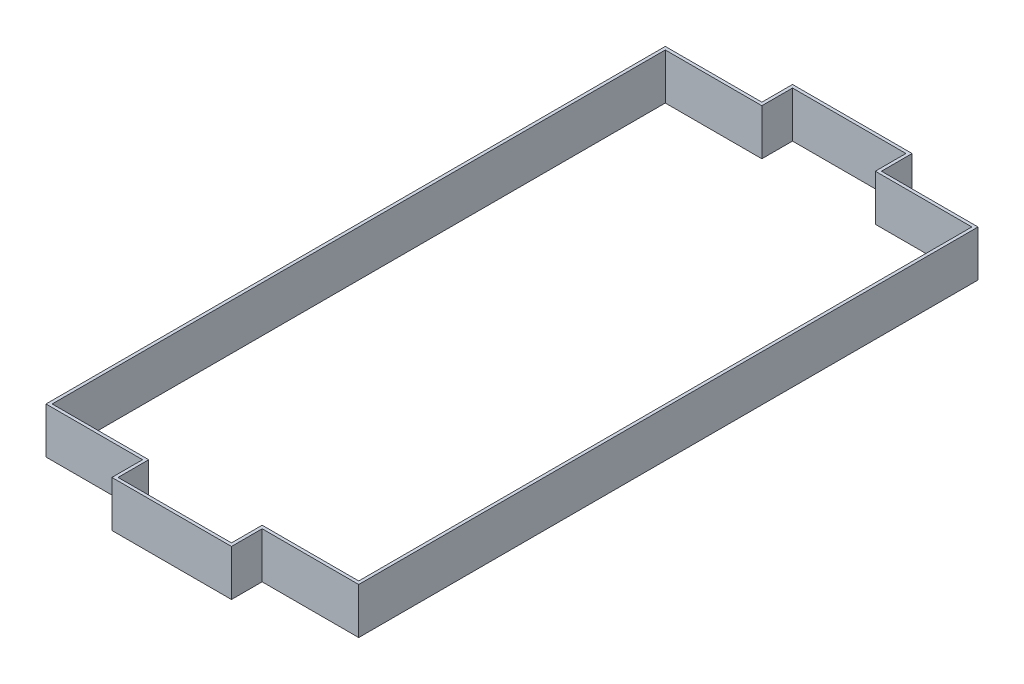
ISO-10303-21;
HEADER;
FILE_DESCRIPTION(('STEP AP214'),'2;1');
FILE_NAME('part.step','',(''),(''),'','','');
FILE_SCHEMA(('AUTOMOTIVE_DESIGN { 1 0 10303 214 1 1 1 1 }'));
ENDSEC;
DATA;
#1=APPLICATION_CONTEXT('core data for automotive mechanical design processes');
#2=APPLICATION_PROTOCOL_DEFINITION('international standard','automotive_design',2000,#1);
#3=PRODUCT_CONTEXT('',#1,'mechanical');
#4=PRODUCT('Part','Part','',(#3));
#5=PRODUCT_RELATED_PRODUCT_CATEGORY('part','',(#4));
#6=PRODUCT_DEFINITION_FORMATION('','',#4);
#7=PRODUCT_DEFINITION_CONTEXT('part definition',#1,'design');
#8=PRODUCT_DEFINITION('design','',#6,#7);
#9=PRODUCT_DEFINITION_SHAPE('','',#8);
#10=(LENGTH_UNIT() NAMED_UNIT(*) SI_UNIT(.MILLI.,.METRE.));
#11=(NAMED_UNIT(*) PLANE_ANGLE_UNIT() SI_UNIT($,.RADIAN.));
#12=(NAMED_UNIT(*) SI_UNIT($,.STERADIAN.) SOLID_ANGLE_UNIT());
#13=UNCERTAINTY_MEASURE_WITH_UNIT(LENGTH_MEASURE(1.E-05),#10,'distance_accuracy_value','');
#14=(GEOMETRIC_REPRESENTATION_CONTEXT(3) GLOBAL_UNCERTAINTY_ASSIGNED_CONTEXT((#13)) GLOBAL_UNIT_ASSIGNED_CONTEXT((#10,
#11,#12)) REPRESENTATION_CONTEXT('',''));
#15=CARTESIAN_POINT('',(0.,0.,0.));
#16=DIRECTION('',(0.,0.,1.));
#17=DIRECTION('',(1.,0.,0.));
#18=AXIS2_PLACEMENT_3D('',#15,#16,#17);
#19=CARTESIAN_POINT('',(0.,150.,-2100.));
#20=DIRECTION('',(0.,0.,-1.));
#21=DIRECTION('',(-1.,0.,0.));
#22=AXIS2_PLACEMENT_3D('',#19,#20,#21);
#23=PLANE('',#22);
#24=DIRECTION('',(1.,0.,0.));
#25=VECTOR('',#24,1.);
#26=CARTESIAN_POINT('',(0.,0.,-2100.));
#27=LINE('',#26,#25);
#28=CARTESIAN_POINT('',(315.,0.,-2100.));
#29=VERTEX_POINT('',#28);
#30=CARTESIAN_POINT('',(685.,0.,-2100.));
#31=VERTEX_POINT('',#30);
#32=EDGE_CURVE('E267',#29,#31,#27,.T.);
#33=ORIENTED_EDGE('',*,*,#32,.T.);
#34=DIRECTION('',(0.,-1.,0.));
#35=VECTOR('',#34,1.);
#36=CARTESIAN_POINT('',(685.,150.,-2100.));
#37=LINE('',#36,#35);
#38=CARTESIAN_POINT('',(685.,150.,-2100.));
#39=VERTEX_POINT('',#38);
#40=EDGE_CURVE('E11',#39,#31,#37,.T.);
#41=ORIENTED_EDGE('',*,*,#40,.F.);
#42=DIRECTION('',(1.,0.,0.));
#43=VECTOR('',#42,1.);
#44=CARTESIAN_POINT('',(0.,150.,-2100.));
#45=LINE('',#44,#43);
#46=CARTESIAN_POINT('',(315.,150.,-2100.));
#47=VERTEX_POINT('',#46);
#48=EDGE_CURVE('E386',#47,#39,#45,.T.);
#49=ORIENTED_EDGE('',*,*,#48,.F.);
#50=DIRECTION('',(0.,-1.,0.));
#51=VECTOR('',#50,1.);
#52=CARTESIAN_POINT('',(315.,150.,-2100.));
#53=LINE('',#52,#51);
#54=EDGE_CURVE('E54',#47,#29,#53,.T.);
#55=ORIENTED_EDGE('',*,*,#54,.T.);
#56=EDGE_LOOP('',(#33,#41,#49,#55));
#57=FACE_BOUND('',#56,.T.);
#58=ADVANCED_FACE('F35',(#57),#23,.F.);
#59=CARTESIAN_POINT('',(685.,150.,0.));
#60=DIRECTION('',(1.,0.,0.));
#61=DIRECTION('',(0.,0.,-1.));
#62=AXIS2_PLACEMENT_3D('',#59,#60,#61);
#63=PLANE('',#62);
#64=DIRECTION('',(0.,0.,1.));
#65=VECTOR('',#64,1.);
#66=CARTESIAN_POINT('',(685.,0.,0.));
#67=LINE('',#66,#65);
#68=CARTESIAN_POINT('',(685.,0.,-2000.));
#69=VERTEX_POINT('',#68);
#70=EDGE_CURVE('E269',#31,#69,#67,.T.);
#71=ORIENTED_EDGE('',*,*,#70,.T.);
#72=DIRECTION('',(0.,-1.,0.));
#73=VECTOR('',#72,1.);
#74=CARTESIAN_POINT('',(685.,150.,-2000.));
#75=LINE('',#74,#73);
#76=CARTESIAN_POINT('',(685.,150.,-2000.));
#77=VERTEX_POINT('',#76);
#78=EDGE_CURVE('E45',#77,#69,#75,.T.);
#79=ORIENTED_EDGE('',*,*,#78,.F.);
#80=DIRECTION('',(0.,0.,1.));
#81=VECTOR('',#80,1.);
#82=CARTESIAN_POINT('',(685.,150.,0.));
#83=LINE('',#82,#81);
#84=EDGE_CURVE('E388',#39,#77,#83,.T.);
#85=ORIENTED_EDGE('',*,*,#84,.F.);
#86=ORIENTED_EDGE('',*,*,#40,.T.);
#87=EDGE_LOOP('',(#71,#79,#85,#86));
#88=FACE_BOUND('',#87,.T.);
#89=ADVANCED_FACE('F423',(#88),#63,.F.);
#90=CARTESIAN_POINT('',(0.,150.,-2000.));
#91=DIRECTION('',(0.,0.,-1.));
#92=DIRECTION('',(-1.,0.,0.));
#93=AXIS2_PLACEMENT_3D('',#90,#91,#92);
#94=PLANE('',#93);
#95=DIRECTION('',(1.,0.,0.));
#96=VECTOR('',#95,1.);
#97=CARTESIAN_POINT('',(0.,0.,-2000.));
#98=LINE('',#97,#96);
#99=CARTESIAN_POINT('',(1000.,0.,-2000.));
#100=VERTEX_POINT('',#99);
#101=EDGE_CURVE('E271',#69,#100,#98,.T.);
#102=ORIENTED_EDGE('',*,*,#101,.T.);
#103=DIRECTION('',(0.,-1.,0.));
#104=VECTOR('',#103,1.);
#105=CARTESIAN_POINT('',(1000.,150.,-2000.));
#106=LINE('',#105,#104);
#107=CARTESIAN_POINT('',(1000.,150.,-2000.));
#108=VERTEX_POINT('',#107);
#109=EDGE_CURVE('E312',#108,#100,#106,.T.);
#110=ORIENTED_EDGE('',*,*,#109,.F.);
#111=DIRECTION('',(1.,0.,0.));
#112=VECTOR('',#111,1.);
#113=CARTESIAN_POINT('',(0.,150.,-2000.));
#114=LINE('',#113,#112);
#115=EDGE_CURVE('E390',#77,#108,#114,.T.);
#116=ORIENTED_EDGE('',*,*,#115,.F.);
#117=ORIENTED_EDGE('',*,*,#78,.T.);
#118=EDGE_LOOP('',(#102,#110,#116,#117));
#119=FACE_BOUND('',#118,.T.);
#120=ADVANCED_FACE('F428',(#119),#94,.F.);
#121=CARTESIAN_POINT('',(1000.,150.,0.));
#122=DIRECTION('',(-1.,0.,0.));
#123=DIRECTION('',(0.,0.,1.));
#124=AXIS2_PLACEMENT_3D('',#121,#122,#123);
#125=PLANE('',#124);
#126=DIRECTION('',(0.,0.,-1.));
#127=VECTOR('',#126,1.);
#128=CARTESIAN_POINT('',(1000.,0.,0.));
#129=LINE('',#128,#127);
#130=CARTESIAN_POINT('',(1000.,0.,0.));
#131=VERTEX_POINT('',#130);
#132=EDGE_CURVE('E274',#131,#100,#129,.T.);
#133=ORIENTED_EDGE('',*,*,#132,.F.);
#134=DIRECTION('',(0.,-1.,0.));
#135=VECTOR('',#134,1.);
#136=CARTESIAN_POINT('',(1000.,150.,0.));
#137=LINE('',#136,#135);
#138=CARTESIAN_POINT('',(1000.,150.,0.));
#139=VERTEX_POINT('',#138);
#140=EDGE_CURVE('E310',#139,#131,#137,.T.);
#141=ORIENTED_EDGE('',*,*,#140,.F.);
#142=DIRECTION('',(0.,0.,-1.));
#143=VECTOR('',#142,1.);
#144=CARTESIAN_POINT('',(1000.,150.,0.));
#145=LINE('',#144,#143);
#146=EDGE_CURVE('E392',#139,#108,#145,.T.);
#147=ORIENTED_EDGE('',*,*,#146,.T.);
#148=ORIENTED_EDGE('',*,*,#109,.T.);
#149=EDGE_LOOP('',(#133,#141,#147,#148));
#150=FACE_BOUND('',#149,.T.);
#151=ADVANCED_FACE('F492',(#150),#125,.T.);
#152=CARTESIAN_POINT('',(0.,150.,0.));
#153=DIRECTION('',(0.,0.,-1.));
#154=DIRECTION('',(-1.,0.,0.));
#155=AXIS2_PLACEMENT_3D('',#152,#153,#154);
#156=PLANE('',#155);
#157=DIRECTION('',(1.,0.,0.));
#158=VECTOR('',#157,1.);
#159=CARTESIAN_POINT('',(0.,0.,0.));
#160=LINE('',#159,#158);
#161=CARTESIAN_POINT('',(685.,0.,0.));
#162=VERTEX_POINT('',#161);
#163=EDGE_CURVE('E277',#162,#131,#160,.T.);
#164=ORIENTED_EDGE('',*,*,#163,.F.);
#165=DIRECTION('',(0.,-1.,0.));
#166=VECTOR('',#165,1.);
#167=CARTESIAN_POINT('',(685.,150.,0.));
#168=LINE('',#167,#166);
#169=CARTESIAN_POINT('',(685.,150.,0.));
#170=VERTEX_POINT('',#169);
#171=EDGE_CURVE('E308',#170,#162,#168,.T.);
#172=ORIENTED_EDGE('',*,*,#171,.F.);
#173=DIRECTION('',(1.,0.,0.));
#174=VECTOR('',#173,1.);
#175=CARTESIAN_POINT('',(0.,150.,0.));
#176=LINE('',#175,#174);
#177=EDGE_CURVE('E395',#170,#139,#176,.T.);
#178=ORIENTED_EDGE('',*,*,#177,.T.);
#179=ORIENTED_EDGE('',*,*,#140,.T.);
#180=EDGE_LOOP('',(#164,#172,#178,#179));
#181=FACE_BOUND('',#180,.T.);
#182=ADVANCED_FACE('F488',(#181),#156,.T.);
#183=CARTESIAN_POINT('',(685.,150.,0.));
#184=DIRECTION('',(1.,0.,0.));
#185=DIRECTION('',(0.,0.,-1.));
#186=AXIS2_PLACEMENT_3D('',#183,#184,#185);
#187=PLANE('',#186);
#188=DIRECTION('',(0.,0.,1.));
#189=VECTOR('',#188,1.);
#190=CARTESIAN_POINT('',(685.,0.,0.));
#191=LINE('',#190,#189);
#192=CARTESIAN_POINT('',(685.,0.,100.));
#193=VERTEX_POINT('',#192);
#194=EDGE_CURVE('E280',#162,#193,#191,.T.);
#195=ORIENTED_EDGE('',*,*,#194,.T.);
#196=DIRECTION('',(0.,-1.,0.));
#197=VECTOR('',#196,1.);
#198=CARTESIAN_POINT('',(685.,150.,100.));
#199=LINE('',#198,#197);
#200=CARTESIAN_POINT('',(685.,150.,100.));
#201=VERTEX_POINT('',#200);
#202=EDGE_CURVE('E305',#201,#193,#199,.T.);
#203=ORIENTED_EDGE('',*,*,#202,.F.);
#204=DIRECTION('',(0.,0.,1.));
#205=VECTOR('',#204,1.);
#206=CARTESIAN_POINT('',(685.,150.,0.));
#207=LINE('',#206,#205);
#208=EDGE_CURVE('E398',#170,#201,#207,.T.);
#209=ORIENTED_EDGE('',*,*,#208,.F.);
#210=ORIENTED_EDGE('',*,*,#171,.T.);
#211=EDGE_LOOP('',(#195,#203,#209,#210));
#212=FACE_BOUND('',#211,.T.);
#213=ADVANCED_FACE('F484',(#212),#187,.F.);
#214=CARTESIAN_POINT('',(0.,150.,100.));
#215=DIRECTION('',(0.,0.,1.));
#216=DIRECTION('',(1.,0.,0.));
#217=AXIS2_PLACEMENT_3D('',#214,#215,#216);
#218=PLANE('',#217);
#219=DIRECTION('',(-1.,0.,0.));
#220=VECTOR('',#219,1.);
#221=CARTESIAN_POINT('',(0.,0.,100.));
#222=LINE('',#221,#220);
#223=CARTESIAN_POINT('',(315.,0.,100.));
#224=VERTEX_POINT('',#223);
#225=EDGE_CURVE('E282',#193,#224,#222,.T.);
#226=ORIENTED_EDGE('',*,*,#225,.T.);
#227=DIRECTION('',(0.,-1.,0.));
#228=VECTOR('',#227,1.);
#229=CARTESIAN_POINT('',(315.,150.,100.));
#230=LINE('',#229,#228);
#231=CARTESIAN_POINT('',(315.,150.,100.));
#232=VERTEX_POINT('',#231);
#233=EDGE_CURVE('E303',#232,#224,#230,.T.);
#234=ORIENTED_EDGE('',*,*,#233,.F.);
#235=DIRECTION('',(-1.,0.,0.));
#236=VECTOR('',#235,1.);
#237=CARTESIAN_POINT('',(0.,150.,100.));
#238=LINE('',#237,#236);
#239=EDGE_CURVE('E400',#201,#232,#238,.T.);
#240=ORIENTED_EDGE('',*,*,#239,.F.);
#241=ORIENTED_EDGE('',*,*,#202,.T.);
#242=EDGE_LOOP('',(#226,#234,#240,#241));
#243=FACE_BOUND('',#242,.T.);
#244=ADVANCED_FACE('F480',(#243),#218,.F.);
#245=CARTESIAN_POINT('',(315.,150.,0.));
#246=DIRECTION('',(1.,0.,0.));
#247=DIRECTION('',(0.,0.,-1.));
#248=AXIS2_PLACEMENT_3D('',#245,#246,#247);
#249=PLANE('',#248);
#250=DIRECTION('',(0.,0.,1.));
#251=VECTOR('',#250,1.);
#252=CARTESIAN_POINT('',(315.,0.,0.));
#253=LINE('',#252,#251);
#254=CARTESIAN_POINT('',(315.,0.,0.));
#255=VERTEX_POINT('',#254);
#256=EDGE_CURVE('E285',#255,#224,#253,.T.);
#257=ORIENTED_EDGE('',*,*,#256,.F.);
#258=DIRECTION('',(0.,-1.,0.));
#259=VECTOR('',#258,1.);
#260=CARTESIAN_POINT('',(315.,150.,0.));
#261=LINE('',#260,#259);
#262=CARTESIAN_POINT('',(315.,150.,0.));
#263=VERTEX_POINT('',#262);
#264=EDGE_CURVE('E301',#263,#255,#261,.T.);
#265=ORIENTED_EDGE('',*,*,#264,.F.);
#266=DIRECTION('',(0.,0.,1.));
#267=VECTOR('',#266,1.);
#268=CARTESIAN_POINT('',(315.,150.,0.));
#269=LINE('',#268,#267);
#270=EDGE_CURVE('E402',#263,#232,#269,.T.);
#271=ORIENTED_EDGE('',*,*,#270,.T.);
#272=ORIENTED_EDGE('',*,*,#233,.T.);
#273=EDGE_LOOP('',(#257,#265,#271,#272));
#274=FACE_BOUND('',#273,.T.);
#275=ADVANCED_FACE('F477',(#274),#249,.T.);
#276=CARTESIAN_POINT('',(0.,150.,0.));
#277=DIRECTION('',(0.,0.,-1.));
#278=DIRECTION('',(-1.,0.,0.));
#279=AXIS2_PLACEMENT_3D('',#276,#277,#278);
#280=PLANE('',#279);
#281=DIRECTION('',(1.,0.,0.));
#282=VECTOR('',#281,1.);
#283=CARTESIAN_POINT('',(0.,0.,0.));
#284=LINE('',#283,#282);
#285=CARTESIAN_POINT('',(0.,0.,0.));
#286=VERTEX_POINT('',#285);
#287=EDGE_CURVE('E288',#286,#255,#284,.T.);
#288=ORIENTED_EDGE('',*,*,#287,.F.);
#289=DIRECTION('',(0.,-1.,0.));
#290=VECTOR('',#289,1.);
#291=CARTESIAN_POINT('',(0.,150.,0.));
#292=LINE('',#291,#290);
#293=CARTESIAN_POINT('',(0.,150.,0.));
#294=VERTEX_POINT('',#293);
#295=EDGE_CURVE('E224',#294,#286,#292,.T.);
#296=ORIENTED_EDGE('',*,*,#295,.F.);
#297=DIRECTION('',(1.,0.,0.));
#298=VECTOR('',#297,1.);
#299=CARTESIAN_POINT('',(0.,150.,0.));
#300=LINE('',#299,#298);
#301=EDGE_CURVE('E214',#294,#263,#300,.T.);
#302=ORIENTED_EDGE('',*,*,#301,.T.);
#303=ORIENTED_EDGE('',*,*,#264,.T.);
#304=EDGE_LOOP('',(#288,#296,#302,#303));
#305=FACE_BOUND('',#304,.T.);
#306=ADVANCED_FACE('F406',(#305),#280,.T.);
#307=CARTESIAN_POINT('',(0.,150.,0.));
#308=DIRECTION('',(-1.,0.,0.));
#309=DIRECTION('',(0.,0.,1.));
#310=AXIS2_PLACEMENT_3D('',#307,#308,#309);
#311=PLANE('',#310);
#312=DIRECTION('',(0.,0.,-1.));
#313=VECTOR('',#312,1.);
#314=CARTESIAN_POINT('',(0.,0.,0.));
#315=LINE('',#314,#313);
#316=CARTESIAN_POINT('',(0.,0.,-2000.));
#317=VERTEX_POINT('',#316);
#318=EDGE_CURVE('E221',#286,#317,#315,.T.);
#319=ORIENTED_EDGE('',*,*,#318,.T.);
#320=DIRECTION('',(0.,-1.,0.));
#321=VECTOR('',#320,1.);
#322=CARTESIAN_POINT('',(0.,150.,-2000.));
#323=LINE('',#322,#321);
#324=CARTESIAN_POINT('',(0.,150.,-2000.));
#325=VERTEX_POINT('',#324);
#326=EDGE_CURVE('E218',#325,#317,#323,.T.);
#327=ORIENTED_EDGE('',*,*,#326,.F.);
#328=DIRECTION('',(0.,0.,-1.));
#329=VECTOR('',#328,1.);
#330=CARTESIAN_POINT('',(0.,150.,0.));
#331=LINE('',#330,#329);
#332=EDGE_CURVE('E205',#294,#325,#331,.T.);
#333=ORIENTED_EDGE('',*,*,#332,.F.);
#334=ORIENTED_EDGE('',*,*,#295,.T.);
#335=EDGE_LOOP('',(#319,#327,#333,#334));
#336=FACE_BOUND('',#335,.T.);
#337=ADVANCED_FACE('F219',(#336),#311,.F.);
#338=CARTESIAN_POINT('',(0.,150.,-2000.));
#339=DIRECTION('',(0.,0.,-1.));
#340=DIRECTION('',(-1.,0.,0.));
#341=AXIS2_PLACEMENT_3D('',#338,#339,#340);
#342=PLANE('',#341);
#343=DIRECTION('',(1.,0.,0.));
#344=VECTOR('',#343,1.);
#345=CARTESIAN_POINT('',(0.,0.,-2000.));
#346=LINE('',#345,#344);
#347=CARTESIAN_POINT('',(315.,0.,-2000.));
#348=VERTEX_POINT('',#347);
#349=EDGE_CURVE('E292',#317,#348,#346,.T.);
#350=ORIENTED_EDGE('',*,*,#349,.T.);
#351=DIRECTION('',(0.,-1.,0.));
#352=VECTOR('',#351,1.);
#353=CARTESIAN_POINT('',(315.,150.,-2000.));
#354=LINE('',#353,#352);
#355=CARTESIAN_POINT('',(315.,150.,-2000.));
#356=VERTEX_POINT('',#355);
#357=EDGE_CURVE('E129',#356,#348,#354,.T.);
#358=ORIENTED_EDGE('',*,*,#357,.F.);
#359=DIRECTION('',(1.,0.,0.));
#360=VECTOR('',#359,1.);
#361=CARTESIAN_POINT('',(0.,150.,-2000.));
#362=LINE('',#361,#360);
#363=EDGE_CURVE('E211',#325,#356,#362,.T.);
#364=ORIENTED_EDGE('',*,*,#363,.F.);
#365=ORIENTED_EDGE('',*,*,#326,.T.);
#366=EDGE_LOOP('',(#350,#358,#364,#365));
#367=FACE_BOUND('',#366,.T.);
#368=ADVANCED_FACE('F226',(#367),#342,.F.);
#369=CARTESIAN_POINT('',(0.,150.,-2010.));
#370=DIRECTION('',(0.,0.,-1.));
#371=DIRECTION('',(-1.,0.,0.));
#372=AXIS2_PLACEMENT_3D('',#369,#370,#371);
#373=PLANE('',#372);
#374=DIRECTION('',(1.,0.,0.));
#375=VECTOR('',#374,1.);
#376=CARTESIAN_POINT('',(0.,0.,-2010.));
#377=LINE('',#376,#375);
#378=CARTESIAN_POINT('',(695.,0.,-2010.));
#379=VERTEX_POINT('',#378);
#380=CARTESIAN_POINT('',(1010.,0.,-2010.));
#381=VERTEX_POINT('',#380);
#382=EDGE_CURVE('E233',#379,#381,#377,.T.);
#383=ORIENTED_EDGE('',*,*,#382,.F.);
#384=DIRECTION('',(0.,-1.,0.));
#385=VECTOR('',#384,1.);
#386=CARTESIAN_POINT('',(695.,150.,-2010.));
#387=LINE('',#386,#385);
#388=CARTESIAN_POINT('',(695.,150.,-2010.));
#389=VERTEX_POINT('',#388);
#390=EDGE_CURVE('E39',#389,#379,#387,.T.);
#391=ORIENTED_EDGE('',*,*,#390,.F.);
#392=DIRECTION('',(1.,0.,0.));
#393=VECTOR('',#392,1.);
#394=CARTESIAN_POINT('',(0.,150.,-2010.));
#395=LINE('',#394,#393);
#396=CARTESIAN_POINT('',(1010.,150.,-2010.));
#397=VERTEX_POINT('',#396);
#398=EDGE_CURVE('E297',#389,#397,#395,.T.);
#399=ORIENTED_EDGE('',*,*,#398,.T.);
#400=DIRECTION('',(0.,-1.,0.));
#401=VECTOR('',#400,1.);
#402=CARTESIAN_POINT('',(1010.,150.,-2010.));
#403=LINE('',#402,#401);
#404=EDGE_CURVE('E229',#397,#381,#403,.T.);
#405=ORIENTED_EDGE('',*,*,#404,.T.);
#406=EDGE_LOOP('',(#383,#391,#399,#405));
#407=FACE_BOUND('',#406,.T.);
#408=ADVANCED_FACE('F37',(#407),#373,.T.);
#409=CARTESIAN_POINT('',(695.,150.,0.));
#410=DIRECTION('',(1.,0.,0.));
#411=DIRECTION('',(0.,0.,-1.));
#412=AXIS2_PLACEMENT_3D('',#409,#410,#411);
#413=PLANE('',#412);
#414=DIRECTION('',(0.,0.,1.));
#415=VECTOR('',#414,1.);
#416=CARTESIAN_POINT('',(695.,0.,0.));
#417=LINE('',#416,#415);
#418=CARTESIAN_POINT('',(695.,0.,-2110.));
#419=VERTEX_POINT('',#418);
#420=EDGE_CURVE('E236',#419,#379,#417,.T.);
#421=ORIENTED_EDGE('',*,*,#420,.F.);
#422=DIRECTION('',(0.,-1.,0.));
#423=VECTOR('',#422,1.);
#424=CARTESIAN_POINT('',(695.,150.,-2110.));
#425=LINE('',#424,#423);
#426=CARTESIAN_POINT('',(695.,150.,-2110.));
#427=VERTEX_POINT('',#426);
#428=EDGE_CURVE('E336',#427,#419,#425,.T.);
#429=ORIENTED_EDGE('',*,*,#428,.F.);
#430=DIRECTION('',(0.,0.,1.));
#431=VECTOR('',#430,1.);
#432=CARTESIAN_POINT('',(695.,150.,0.));
#433=LINE('',#432,#431);
#434=EDGE_CURVE('E345',#427,#389,#433,.T.);
#435=ORIENTED_EDGE('',*,*,#434,.T.);
#436=ORIENTED_EDGE('',*,*,#390,.T.);
#437=EDGE_LOOP('',(#421,#429,#435,#436));
#438=FACE_BOUND('',#437,.T.);
#439=ADVANCED_FACE('F343',(#438),#413,.T.);
#440=CARTESIAN_POINT('',(0.,150.,-2110.));
#441=DIRECTION('',(0.,0.,-1.));
#442=DIRECTION('',(-1.,0.,0.));
#443=AXIS2_PLACEMENT_3D('',#440,#441,#442);
#444=PLANE('',#443);
#445=DIRECTION('',(1.,0.,0.));
#446=VECTOR('',#445,1.);
#447=CARTESIAN_POINT('',(0.,0.,-2110.));
#448=LINE('',#447,#446);
#449=CARTESIAN_POINT('',(305.,0.,-2110.));
#450=VERTEX_POINT('',#449);
#451=EDGE_CURVE('E239',#450,#419,#448,.T.);
#452=ORIENTED_EDGE('',*,*,#451,.F.);
#453=DIRECTION('',(0.,-1.,0.));
#454=VECTOR('',#453,1.);
#455=CARTESIAN_POINT('',(305.,150.,-2110.));
#456=LINE('',#455,#454);
#457=CARTESIAN_POINT('',(305.,150.,-2110.));
#458=VERTEX_POINT('',#457);
#459=EDGE_CURVE('E335',#458,#450,#456,.T.);
#460=ORIENTED_EDGE('',*,*,#459,.F.);
#461=DIRECTION('',(1.,0.,0.));
#462=VECTOR('',#461,1.);
#463=CARTESIAN_POINT('',(0.,150.,-2110.));
#464=LINE('',#463,#462);
#465=EDGE_CURVE('E354',#458,#427,#464,.T.);
#466=ORIENTED_EDGE('',*,*,#465,.T.);
#467=ORIENTED_EDGE('',*,*,#428,.T.);
#468=EDGE_LOOP('',(#452,#460,#466,#467));
#469=FACE_BOUND('',#468,.T.);
#470=ADVANCED_FACE('F352',(#469),#444,.T.);
#471=CARTESIAN_POINT('',(305.,150.,0.));
#472=DIRECTION('',(-1.,0.,0.));
#473=DIRECTION('',(0.,0.,1.));
#474=AXIS2_PLACEMENT_3D('',#471,#472,#473);
#475=PLANE('',#474);
#476=DIRECTION('',(0.,0.,-1.));
#477=VECTOR('',#476,1.);
#478=CARTESIAN_POINT('',(305.,0.,0.));
#479=LINE('',#478,#477);
#480=CARTESIAN_POINT('',(305.,0.,-2010.));
#481=VERTEX_POINT('',#480);
#482=EDGE_CURVE('E242',#481,#450,#479,.T.);
#483=ORIENTED_EDGE('',*,*,#482,.F.);
#484=DIRECTION('',(0.,-1.,0.));
#485=VECTOR('',#484,1.);
#486=CARTESIAN_POINT('',(305.,150.,-2010.));
#487=LINE('',#486,#485);
#488=CARTESIAN_POINT('',(305.,150.,-2010.));
#489=VERTEX_POINT('',#488);
#490=EDGE_CURVE('E333',#489,#481,#487,.T.);
#491=ORIENTED_EDGE('',*,*,#490,.F.);
#492=DIRECTION('',(0.,0.,-1.));
#493=VECTOR('',#492,1.);
#494=CARTESIAN_POINT('',(305.,150.,0.));
#495=LINE('',#494,#493);
#496=EDGE_CURVE('E360',#489,#458,#495,.T.);
#497=ORIENTED_EDGE('',*,*,#496,.T.);
#498=ORIENTED_EDGE('',*,*,#459,.T.);
#499=EDGE_LOOP('',(#483,#491,#497,#498));
#500=FACE_BOUND('',#499,.T.);
#501=ADVANCED_FACE('F363',(#500),#475,.T.);
#502=CARTESIAN_POINT('',(0.,150.,-2010.));
#503=DIRECTION('',(0.,0.,-1.));
#504=DIRECTION('',(-1.,0.,0.));
#505=AXIS2_PLACEMENT_3D('',#502,#503,#504);
#506=PLANE('',#505);
#507=DIRECTION('',(1.,0.,0.));
#508=VECTOR('',#507,1.);
#509=CARTESIAN_POINT('',(0.,0.,-2010.));
#510=LINE('',#509,#508);
#511=CARTESIAN_POINT('',(-10.,0.,-2010.));
#512=VERTEX_POINT('',#511);
#513=EDGE_CURVE('E245',#512,#481,#510,.T.);
#514=ORIENTED_EDGE('',*,*,#513,.F.);
#515=DIRECTION('',(0.,-1.,0.));
#516=VECTOR('',#515,1.);
#517=CARTESIAN_POINT('',(-10.,150.,-2010.));
#518=LINE('',#517,#516);
#519=CARTESIAN_POINT('',(-10.,150.,-2010.));
#520=VERTEX_POINT('',#519);
#521=EDGE_CURVE('E331',#520,#512,#518,.T.);
#522=ORIENTED_EDGE('',*,*,#521,.F.);
#523=DIRECTION('',(1.,0.,0.));
#524=VECTOR('',#523,1.);
#525=CARTESIAN_POINT('',(0.,150.,-2010.));
#526=LINE('',#525,#524);
#527=EDGE_CURVE('E364',#520,#489,#526,.T.);
#528=ORIENTED_EDGE('',*,*,#527,.T.);
#529=ORIENTED_EDGE('',*,*,#490,.T.);
#530=EDGE_LOOP('',(#514,#522,#528,#529));
#531=FACE_BOUND('',#530,.T.);
#532=ADVANCED_FACE('F455',(#531),#506,.T.);
#533=CARTESIAN_POINT('',(-10.,150.,0.));
#534=DIRECTION('',(-1.,0.,0.));
#535=DIRECTION('',(0.,0.,1.));
#536=AXIS2_PLACEMENT_3D('',#533,#534,#535);
#537=PLANE('',#536);
#538=DIRECTION('',(0.,0.,-1.));
#539=VECTOR('',#538,1.);
#540=CARTESIAN_POINT('',(-10.,0.,0.));
#541=LINE('',#540,#539);
#542=CARTESIAN_POINT('',(-10.,0.,10.));
#543=VERTEX_POINT('',#542);
#544=EDGE_CURVE('E248',#543,#512,#541,.T.);
#545=ORIENTED_EDGE('',*,*,#544,.F.);
#546=DIRECTION('',(0.,-1.,0.));
#547=VECTOR('',#546,1.);
#548=CARTESIAN_POINT('',(-10.,150.,10.));
#549=LINE('',#548,#547);
#550=CARTESIAN_POINT('',(-10.,150.,10.));
#551=VERTEX_POINT('',#550);
#552=EDGE_CURVE('E329',#551,#543,#549,.T.);
#553=ORIENTED_EDGE('',*,*,#552,.F.);
#554=DIRECTION('',(0.,0.,-1.));
#555=VECTOR('',#554,1.);
#556=CARTESIAN_POINT('',(-10.,150.,0.));
#557=LINE('',#556,#555);
#558=EDGE_CURVE('E366',#551,#520,#557,.T.);
#559=ORIENTED_EDGE('',*,*,#558,.T.);
#560=ORIENTED_EDGE('',*,*,#521,.T.);
#561=EDGE_LOOP('',(#545,#553,#559,#560));
#562=FACE_BOUND('',#561,.T.);
#563=ADVANCED_FACE('F451',(#562),#537,.T.);
#564=CARTESIAN_POINT('',(0.,150.,10.));
#565=DIRECTION('',(0.,0.,-1.));
#566=DIRECTION('',(-1.,0.,0.));
#567=AXIS2_PLACEMENT_3D('',#564,#565,#566);
#568=PLANE('',#567);
#569=DIRECTION('',(1.,0.,0.));
#570=VECTOR('',#569,1.);
#571=CARTESIAN_POINT('',(0.,0.,10.));
#572=LINE('',#571,#570);
#573=CARTESIAN_POINT('',(305.,0.,10.));
#574=VERTEX_POINT('',#573);
#575=EDGE_CURVE('E251',#543,#574,#572,.T.);
#576=ORIENTED_EDGE('',*,*,#575,.T.);
#577=DIRECTION('',(0.,-1.,0.));
#578=VECTOR('',#577,1.);
#579=CARTESIAN_POINT('',(305.,150.,10.));
#580=LINE('',#579,#578);
#581=CARTESIAN_POINT('',(305.,150.,10.));
#582=VERTEX_POINT('',#581);
#583=EDGE_CURVE('E326',#582,#574,#580,.T.);
#584=ORIENTED_EDGE('',*,*,#583,.F.);
#585=DIRECTION('',(1.,0.,0.));
#586=VECTOR('',#585,1.);
#587=CARTESIAN_POINT('',(0.,150.,10.));
#588=LINE('',#587,#586);
#589=EDGE_CURVE('E372',#551,#582,#588,.T.);
#590=ORIENTED_EDGE('',*,*,#589,.F.);
#591=ORIENTED_EDGE('',*,*,#552,.T.);
#592=EDGE_LOOP('',(#576,#584,#590,#591));
#593=FACE_BOUND('',#592,.T.);
#594=ADVANCED_FACE('F447',(#593),#568,.F.);
#595=CARTESIAN_POINT('',(305.,150.,1.69309011255336E-13));
#596=DIRECTION('',(1.,0.,0.));
#597=DIRECTION('',(0.,0.,-1.));
#598=AXIS2_PLACEMENT_3D('',#595,#596,#597);
#599=PLANE('',#598);
#600=DIRECTION('',(0.,0.,1.));
#601=VECTOR('',#600,1.);
#602=CARTESIAN_POINT('',(305.,0.,1.69309011255336E-13));
#603=LINE('',#602,#601);
#604=CARTESIAN_POINT('',(305.,0.,110.));
#605=VERTEX_POINT('',#604);
#606=EDGE_CURVE('E253',#574,#605,#603,.T.);
#607=ORIENTED_EDGE('',*,*,#606,.T.);
#608=DIRECTION('',(0.,-1.,0.));
#609=VECTOR('',#608,1.);
#610=CARTESIAN_POINT('',(305.,150.,110.));
#611=LINE('',#610,#609);
#612=CARTESIAN_POINT('',(305.,150.,110.));
#613=VERTEX_POINT('',#612);
#614=EDGE_CURVE('E324',#613,#605,#611,.T.);
#615=ORIENTED_EDGE('',*,*,#614,.F.);
#616=DIRECTION('',(0.,0.,1.));
#617=VECTOR('',#616,1.);
#618=CARTESIAN_POINT('',(305.,150.,1.69309011255336E-13));
#619=LINE('',#618,#617);
#620=EDGE_CURVE('E374',#582,#613,#619,.T.);
#621=ORIENTED_EDGE('',*,*,#620,.F.);
#622=ORIENTED_EDGE('',*,*,#583,.T.);
#623=EDGE_LOOP('',(#607,#615,#621,#622));
#624=FACE_BOUND('',#623,.T.);
#625=ADVANCED_FACE('F443',(#624),#599,.F.);
#626=CARTESIAN_POINT('',(0.,150.,110.));
#627=DIRECTION('',(0.,0.,1.));
#628=DIRECTION('',(1.,0.,0.));
#629=AXIS2_PLACEMENT_3D('',#626,#627,#628);
#630=PLANE('',#629);
#631=DIRECTION('',(-1.,0.,0.));
#632=VECTOR('',#631,1.);
#633=CARTESIAN_POINT('',(0.,0.,110.));
#634=LINE('',#633,#632);
#635=CARTESIAN_POINT('',(695.,0.,110.));
#636=VERTEX_POINT('',#635);
#637=EDGE_CURVE('E256',#636,#605,#634,.T.);
#638=ORIENTED_EDGE('',*,*,#637,.F.);
#639=DIRECTION('',(0.,-1.,0.));
#640=VECTOR('',#639,1.);
#641=CARTESIAN_POINT('',(695.,150.,110.));
#642=LINE('',#641,#640);
#643=CARTESIAN_POINT('',(695.,150.,110.));
#644=VERTEX_POINT('',#643);
#645=EDGE_CURVE('E322',#644,#636,#642,.T.);
#646=ORIENTED_EDGE('',*,*,#645,.F.);
#647=DIRECTION('',(-1.,0.,0.));
#648=VECTOR('',#647,1.);
#649=CARTESIAN_POINT('',(0.,150.,110.));
#650=LINE('',#649,#648);
#651=EDGE_CURVE('E376',#644,#613,#650,.T.);
#652=ORIENTED_EDGE('',*,*,#651,.T.);
#653=ORIENTED_EDGE('',*,*,#614,.T.);
#654=EDGE_LOOP('',(#638,#646,#652,#653));
#655=FACE_BOUND('',#654,.T.);
#656=ADVANCED_FACE('F439',(#655),#630,.T.);
#657=CARTESIAN_POINT('',(695.,150.,0.));
#658=DIRECTION('',(1.,0.,0.));
#659=DIRECTION('',(0.,0.,-1.));
#660=AXIS2_PLACEMENT_3D('',#657,#658,#659);
#661=PLANE('',#660);
#662=DIRECTION('',(0.,0.,1.));
#663=VECTOR('',#662,1.);
#664=CARTESIAN_POINT('',(695.,0.,0.));
#665=LINE('',#664,#663);
#666=CARTESIAN_POINT('',(695.,0.,10.));
#667=VERTEX_POINT('',#666);
#668=EDGE_CURVE('E259',#667,#636,#665,.T.);
#669=ORIENTED_EDGE('',*,*,#668,.F.);
#670=DIRECTION('',(0.,-1.,0.));
#671=VECTOR('',#670,1.);
#672=CARTESIAN_POINT('',(695.,150.,10.));
#673=LINE('',#672,#671);
#674=CARTESIAN_POINT('',(695.,150.,10.));
#675=VERTEX_POINT('',#674);
#676=EDGE_CURVE('E320',#675,#667,#673,.T.);
#677=ORIENTED_EDGE('',*,*,#676,.F.);
#678=DIRECTION('',(0.,0.,1.));
#679=VECTOR('',#678,1.);
#680=CARTESIAN_POINT('',(695.,150.,0.));
#681=LINE('',#680,#679);
#682=EDGE_CURVE('E379',#675,#644,#681,.T.);
#683=ORIENTED_EDGE('',*,*,#682,.T.);
#684=ORIENTED_EDGE('',*,*,#645,.T.);
#685=EDGE_LOOP('',(#669,#677,#683,#684));
#686=FACE_BOUND('',#685,.T.);
#687=ADVANCED_FACE('F435',(#686),#661,.T.);
#688=CARTESIAN_POINT('',(0.,150.,10.));
#689=DIRECTION('',(0.,0.,-1.));
#690=DIRECTION('',(-1.,0.,0.));
#691=AXIS2_PLACEMENT_3D('',#688,#689,#690);
#692=PLANE('',#691);
#693=DIRECTION('',(1.,0.,0.));
#694=VECTOR('',#693,1.);
#695=CARTESIAN_POINT('',(0.,0.,10.));
#696=LINE('',#695,#694);
#697=CARTESIAN_POINT('',(1010.,0.,10.));
#698=VERTEX_POINT('',#697);
#699=EDGE_CURVE('E262',#667,#698,#696,.T.);
#700=ORIENTED_EDGE('',*,*,#699,.T.);
#701=DIRECTION('',(0.,-1.,0.));
#702=VECTOR('',#701,1.);
#703=CARTESIAN_POINT('',(1010.,150.,10.));
#704=LINE('',#703,#702);
#705=CARTESIAN_POINT('',(1010.,150.,10.));
#706=VERTEX_POINT('',#705);
#707=EDGE_CURVE('E317',#706,#698,#704,.T.);
#708=ORIENTED_EDGE('',*,*,#707,.F.);
#709=DIRECTION('',(1.,0.,0.));
#710=VECTOR('',#709,1.);
#711=CARTESIAN_POINT('',(0.,150.,10.));
#712=LINE('',#711,#710);
#713=EDGE_CURVE('E382',#675,#706,#712,.T.);
#714=ORIENTED_EDGE('',*,*,#713,.F.);
#715=ORIENTED_EDGE('',*,*,#676,.T.);
#716=EDGE_LOOP('',(#700,#708,#714,#715));
#717=FACE_BOUND('',#716,.T.);
#718=ADVANCED_FACE('F417',(#717),#692,.F.);
#719=CARTESIAN_POINT('',(1010.,150.,0.));
#720=DIRECTION('',(-1.,0.,0.));
#721=DIRECTION('',(0.,0.,1.));
#722=AXIS2_PLACEMENT_3D('',#719,#720,#721);
#723=PLANE('',#722);
#724=DIRECTION('',(0.,0.,-1.));
#725=VECTOR('',#724,1.);
#726=CARTESIAN_POINT('',(1010.,0.,0.));
#727=LINE('',#726,#725);
#728=EDGE_CURVE('E264',#698,#381,#727,.T.);
#729=ORIENTED_EDGE('',*,*,#728,.T.);
#730=ORIENTED_EDGE('',*,*,#404,.F.);
#731=DIRECTION('',(0.,0.,-1.));
#732=VECTOR('',#731,1.);
#733=CARTESIAN_POINT('',(1010.,150.,0.));
#734=LINE('',#733,#732);
#735=EDGE_CURVE('E384',#706,#397,#734,.T.);
#736=ORIENTED_EDGE('',*,*,#735,.F.);
#737=ORIENTED_EDGE('',*,*,#707,.T.);
#738=EDGE_LOOP('',(#729,#730,#736,#737));
#739=FACE_BOUND('',#738,.T.);
#740=ADVANCED_FACE('F410',(#739),#723,.F.);
#741=CARTESIAN_POINT('',(315.,150.,0.));
#742=DIRECTION('',(1.,0.,0.));
#743=DIRECTION('',(0.,0.,-1.));
#744=AXIS2_PLACEMENT_3D('',#741,#742,#743);
#745=PLANE('',#744);
#746=DIRECTION('',(0.,0.,1.));
#747=VECTOR('',#746,1.);
#748=CARTESIAN_POINT('',(315.,0.,0.));
#749=LINE('',#748,#747);
#750=EDGE_CURVE('E294',#29,#348,#749,.T.);
#751=ORIENTED_EDGE('',*,*,#750,.F.);
#752=ORIENTED_EDGE('',*,*,#54,.F.);
#753=DIRECTION('',(0.,0.,1.));
#754=VECTOR('',#753,1.);
#755=CARTESIAN_POINT('',(315.,150.,0.));
#756=LINE('',#755,#754);
#757=EDGE_CURVE('E227',#47,#356,#756,.T.);
#758=ORIENTED_EDGE('',*,*,#757,.T.);
#759=ORIENTED_EDGE('',*,*,#357,.T.);
#760=EDGE_LOOP('',(#751,#752,#758,#759));
#761=FACE_BOUND('',#760,.T.);
#762=ADVANCED_FACE('F408',(#761),#745,.T.);
#763=CARTESIAN_POINT('',(0.,150.,0.));
#764=DIRECTION('',(0.,1.,0.));
#765=DIRECTION('',(0.,0.,1.));
#766=AXIS2_PLACEMENT_3D('',#763,#764,#765);
#767=PLANE('',#766);
#768=ORIENTED_EDGE('',*,*,#398,.F.);
#769=ORIENTED_EDGE('',*,*,#434,.F.);
#770=ORIENTED_EDGE('',*,*,#465,.F.);
#771=ORIENTED_EDGE('',*,*,#496,.F.);
#772=ORIENTED_EDGE('',*,*,#527,.F.);
#773=ORIENTED_EDGE('',*,*,#558,.F.);
#774=ORIENTED_EDGE('',*,*,#589,.T.);
#775=ORIENTED_EDGE('',*,*,#620,.T.);
#776=ORIENTED_EDGE('',*,*,#651,.F.);
#777=ORIENTED_EDGE('',*,*,#682,.F.);
#778=ORIENTED_EDGE('',*,*,#713,.T.);
#779=ORIENTED_EDGE('',*,*,#735,.T.);
#780=EDGE_LOOP('',(#768,#769,#770,#771,#772,#773,#774,#775,#776,#777,#778,#779));
#781=FACE_BOUND('',#780,.T.);
#782=ORIENTED_EDGE('',*,*,#48,.T.);
#783=ORIENTED_EDGE('',*,*,#84,.T.);
#784=ORIENTED_EDGE('',*,*,#115,.T.);
#785=ORIENTED_EDGE('',*,*,#146,.F.);
#786=ORIENTED_EDGE('',*,*,#177,.F.);
#787=ORIENTED_EDGE('',*,*,#208,.T.);
#788=ORIENTED_EDGE('',*,*,#239,.T.);
#789=ORIENTED_EDGE('',*,*,#270,.F.);
#790=ORIENTED_EDGE('',*,*,#301,.F.);
#791=ORIENTED_EDGE('',*,*,#332,.T.);
#792=ORIENTED_EDGE('',*,*,#363,.T.);
#793=ORIENTED_EDGE('',*,*,#757,.F.);
#794=EDGE_LOOP('',(#782,#783,#784,#785,#786,#787,#788,#789,#790,#791,#792,#793));
#795=FACE_BOUND('',#794,.T.);
#796=ADVANCED_FACE('F208',(#781,#795),#767,.T.);
#797=CARTESIAN_POINT('',(0.,0.,0.));
#798=DIRECTION('',(0.,1.,0.));
#799=DIRECTION('',(0.,0.,1.));
#800=AXIS2_PLACEMENT_3D('',#797,#798,#799);
#801=PLANE('',#800);
#802=ORIENTED_EDGE('',*,*,#382,.T.);
#803=ORIENTED_EDGE('',*,*,#728,.F.);
#804=ORIENTED_EDGE('',*,*,#699,.F.);
#805=ORIENTED_EDGE('',*,*,#668,.T.);
#806=ORIENTED_EDGE('',*,*,#637,.T.);
#807=ORIENTED_EDGE('',*,*,#606,.F.);
#808=ORIENTED_EDGE('',*,*,#575,.F.);
#809=ORIENTED_EDGE('',*,*,#544,.T.);
#810=ORIENTED_EDGE('',*,*,#513,.T.);
#811=ORIENTED_EDGE('',*,*,#482,.T.);
#812=ORIENTED_EDGE('',*,*,#451,.T.);
#813=ORIENTED_EDGE('',*,*,#420,.T.);
#814=EDGE_LOOP('',(#802,#803,#804,#805,#806,#807,#808,#809,#810,#811,#812,#813));
#815=FACE_BOUND('',#814,.T.);
#816=ORIENTED_EDGE('',*,*,#32,.F.);
#817=ORIENTED_EDGE('',*,*,#750,.T.);
#818=ORIENTED_EDGE('',*,*,#349,.F.);
#819=ORIENTED_EDGE('',*,*,#318,.F.);
#820=ORIENTED_EDGE('',*,*,#287,.T.);
#821=ORIENTED_EDGE('',*,*,#256,.T.);
#822=ORIENTED_EDGE('',*,*,#225,.F.);
#823=ORIENTED_EDGE('',*,*,#194,.F.);
#824=ORIENTED_EDGE('',*,*,#163,.T.);
#825=ORIENTED_EDGE('',*,*,#132,.T.);
#826=ORIENTED_EDGE('',*,*,#101,.F.);
#827=ORIENTED_EDGE('',*,*,#70,.F.);
#828=EDGE_LOOP('',(#816,#817,#818,#819,#820,#821,#822,#823,#824,#825,#826,#827));
#829=FACE_BOUND('',#828,.T.);
#830=ADVANCED_FACE('F349',(#815,#829),#801,.F.);
#831=CLOSED_SHELL('',(#58,#89,#120,#151,#182,#213,#244,#275,#306,#337,#368,#408,#439,#470,#501,
#532,#563,#594,#625,#656,#687,#718,#740,#762,#796,#830));
#832=MANIFOLD_SOLID_BREP('B2',#831);
#833=ADVANCED_BREP_SHAPE_REPRESENTATION('',(#18,#832),#14);
#834=SHAPE_DEFINITION_REPRESENTATION(#9,#833);
ENDSEC;
END-ISO-10303-21;
